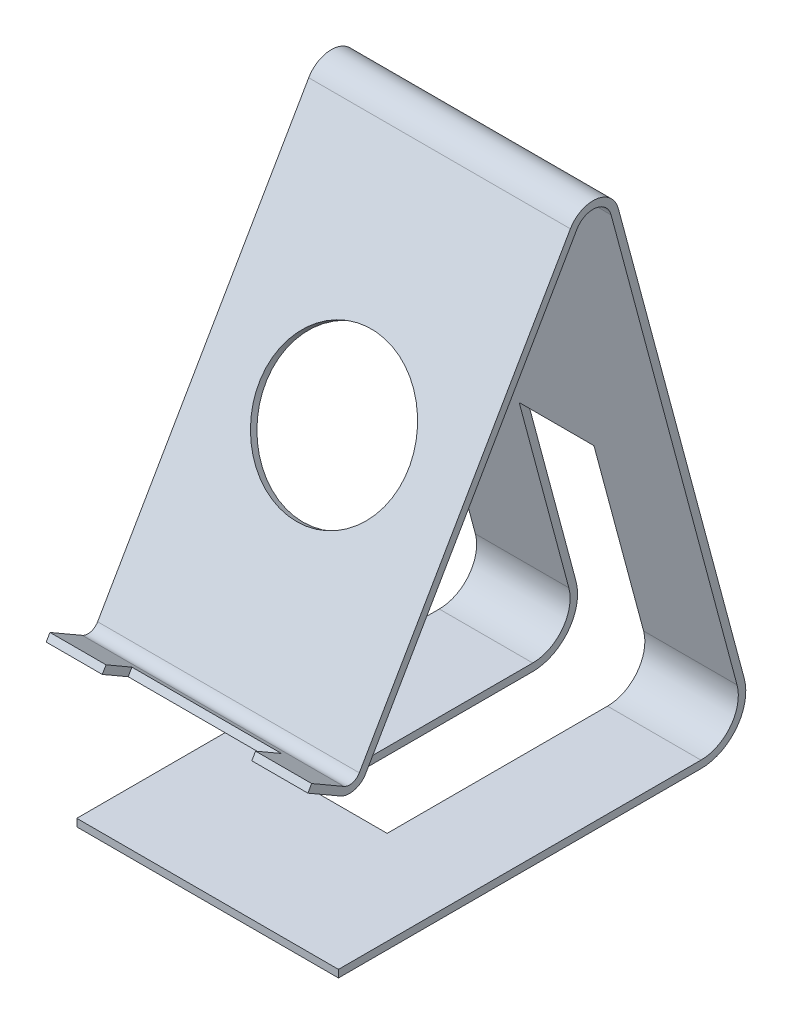
ISO-10303-21;
HEADER;
FILE_DESCRIPTION(('STEP AP214'),'2;1');
FILE_NAME('part.step','',(''),(''),'','','');
FILE_SCHEMA(('AUTOMOTIVE_DESIGN { 1 0 10303 214 1 1 1 1 }'));
ENDSEC;
DATA;
#1=APPLICATION_CONTEXT('core data for automotive mechanical design processes');
#2=APPLICATION_PROTOCOL_DEFINITION('international standard','automotive_design',2000,#1);
#3=PRODUCT_CONTEXT('',#1,'mechanical');
#4=PRODUCT('Part','Part','',(#3));
#5=PRODUCT_RELATED_PRODUCT_CATEGORY('part','',(#4));
#6=PRODUCT_DEFINITION_FORMATION('','',#4);
#7=PRODUCT_DEFINITION_CONTEXT('part definition',#1,'design');
#8=PRODUCT_DEFINITION('design','',#6,#7);
#9=PRODUCT_DEFINITION_SHAPE('','',#8);
#10=(LENGTH_UNIT() NAMED_UNIT(*) SI_UNIT(.MILLI.,.METRE.));
#11=(NAMED_UNIT(*) PLANE_ANGLE_UNIT() SI_UNIT($,.RADIAN.));
#12=(NAMED_UNIT(*) SI_UNIT($,.STERADIAN.) SOLID_ANGLE_UNIT());
#13=UNCERTAINTY_MEASURE_WITH_UNIT(LENGTH_MEASURE(1.E-05),#10,'distance_accuracy_value','');
#14=(GEOMETRIC_REPRESENTATION_CONTEXT(3) GLOBAL_UNCERTAINTY_ASSIGNED_CONTEXT((#13)) GLOBAL_UNIT_ASSIGNED_CONTEXT((#10,
#11,#12)) REPRESENTATION_CONTEXT('',''));
#15=CARTESIAN_POINT('',(0.,0.,0.));
#16=DIRECTION('',(0.,0.,1.));
#17=DIRECTION('',(1.,0.,0.));
#18=AXIS2_PLACEMENT_3D('',#15,#16,#17);
#19=CARTESIAN_POINT('',(70.,10.,-58.9456172710884));
#20=DIRECTION('',(-1.,0.,0.));
#21=DIRECTION('',(0.,0.,1.));
#22=AXIS2_PLACEMENT_3D('',#19,#20,#21);
#23=CYLINDRICAL_SURFACE('',#22,10.);
#24=CARTESIAN_POINT('',(25.,10.,-58.9456172710884));
#25=DIRECTION('',(-1.,0.,0.));
#26=DIRECTION('',(0.,0.,1.));
#27=AXIS2_PLACEMENT_3D('',#24,#25,#26);
#28=CIRCLE('',#27,10.);
#29=CARTESIAN_POINT('',(25.,12.5881904510253,-68.6048755339791));
#30=VERTEX_POINT('',#29);
#31=CARTESIAN_POINT('',(25.,0.,-58.9456172710883));
#32=VERTEX_POINT('',#31);
#33=EDGE_CURVE('E250',#30,#32,#28,.T.);
#34=ORIENTED_EDGE('',*,*,#33,.F.);
#35=DIRECTION('',(-1.,0.,0.));
#36=VECTOR('',#35,1.);
#37=CARTESIAN_POINT('',(70.,12.5881904510253,-68.6048755339791));
#38=LINE('',#37,#36);
#39=CARTESIAN_POINT('',(0.,12.5881904510253,-68.6048755339791));
#40=VERTEX_POINT('',#39);
#41=EDGE_CURVE('E387',#30,#40,#38,.T.);
#42=ORIENTED_EDGE('',*,*,#41,.T.);
#43=CARTESIAN_POINT('',(0.,10.,-58.9456172710884));
#44=DIRECTION('',(1.,0.,0.));
#45=DIRECTION('',(0.,0.,-1.));
#46=AXIS2_PLACEMENT_3D('',#43,#44,#45);
#47=CIRCLE('',#46,10.);
#48=CARTESIAN_POINT('',(0.,0.,-58.9456172710883));
#49=VERTEX_POINT('',#48);
#50=EDGE_CURVE('E341',#49,#40,#47,.T.);
#51=ORIENTED_EDGE('',*,*,#50,.F.);
#52=DIRECTION('',(-1.,0.,0.));
#53=VECTOR('',#52,1.);
#54=CARTESIAN_POINT('',(70.,0.,-58.9456172710883));
#55=LINE('',#54,#53);
#56=EDGE_CURVE('E383',#32,#49,#55,.T.);
#57=ORIENTED_EDGE('',*,*,#56,.F.);
#58=EDGE_LOOP('',(#34,#42,#51,#57));
#59=FACE_BOUND('',#58,.T.);
#60=ADVANCED_FACE('F39',(#59),#23,.F.);
#61=CARTESIAN_POINT('',(70.,10.,-58.9456172710884));
#62=DIRECTION('',(-1.,0.,0.));
#63=DIRECTION('',(0.,0.,1.));
#64=AXIS2_PLACEMENT_3D('',#61,#62,#63);
#65=CYLINDRICAL_SURFACE('',#64,12.);
#66=DIRECTION('',(-1.,0.,0.));
#67=VECTOR('',#66,1.);
#68=CARTESIAN_POINT('',(70.,13.1058285412304,-70.5367271865572));
#69=LINE('',#68,#67);
#70=CARTESIAN_POINT('',(25.,13.1058285412304,-70.5367271865572));
#71=VERTEX_POINT('',#70);
#72=CARTESIAN_POINT('',(0.,13.1058285412304,-70.5367271865572));
#73=VERTEX_POINT('',#72);
#74=EDGE_CURVE('E373',#71,#73,#69,.T.);
#75=ORIENTED_EDGE('',*,*,#74,.F.);
#76=CARTESIAN_POINT('',(25.,10.,-58.9456172710884));
#77=DIRECTION('',(-1.,0.,0.));
#78=DIRECTION('',(0.,0.,1.));
#79=AXIS2_PLACEMENT_3D('',#76,#77,#78);
#80=CIRCLE('',#79,12.);
#81=CARTESIAN_POINT('',(25.,-2.,-58.9456172710883));
#82=VERTEX_POINT('',#81);
#83=EDGE_CURVE('E248',#71,#82,#80,.T.);
#84=ORIENTED_EDGE('',*,*,#83,.T.);
#85=DIRECTION('',(-1.,0.,0.));
#86=VECTOR('',#85,1.);
#87=CARTESIAN_POINT('',(70.,-2.,-58.9456172710883));
#88=LINE('',#87,#86);
#89=CARTESIAN_POINT('',(0.,-2.,-58.9456172710883));
#90=VERTEX_POINT('',#89);
#91=EDGE_CURVE('E244',#82,#90,#88,.T.);
#92=ORIENTED_EDGE('',*,*,#91,.T.);
#93=CARTESIAN_POINT('',(0.,10.,-58.9456172710884));
#94=DIRECTION('',(1.,0.,0.));
#95=DIRECTION('',(0.,0.,-1.));
#96=AXIS2_PLACEMENT_3D('',#93,#94,#95);
#97=CIRCLE('',#96,12.);
#98=EDGE_CURVE('E352',#90,#73,#97,.T.);
#99=ORIENTED_EDGE('',*,*,#98,.T.);
#100=EDGE_LOOP('',(#75,#84,#92,#99));
#101=FACE_BOUND('',#100,.T.);
#102=ADVANCED_FACE('F426',(#101),#65,.T.);
#103=CARTESIAN_POINT('',(70.,44.9166975080222,46.2048889219341));
#104=DIRECTION('',(0.,0.499999999999991,0.866025403784444));
#105=DIRECTION('',(0.,-0.866025403784444,0.499999999999991));
#106=AXIS2_PLACEMENT_3D('',#103,#104,#105);
#107=PLANE('',#106);
#108=DIRECTION('',(0.,0.866025403784444,-0.499999999999991));
#109=VECTOR('',#108,1.);
#110=CARTESIAN_POINT('',(15.,37.9884942777467,50.2048889219341));
#111=LINE('',#110,#109);
#112=CARTESIAN_POINT('',(15.,44.9166975080222,46.2048889219341));
#113=VERTEX_POINT('',#112);
#114=CARTESIAN_POINT('',(15.,46.6487483155911,45.2048889219342));
#115=VERTEX_POINT('',#114);
#116=EDGE_CURVE('E268',#113,#115,#111,.T.);
#117=ORIENTED_EDGE('',*,*,#116,.T.);
#118=DIRECTION('',(-1.,0.,0.));
#119=VECTOR('',#118,1.);
#120=CARTESIAN_POINT('',(70.,46.6487483155911,45.2048889219342));
#121=LINE('',#120,#119);
#122=CARTESIAN_POINT('',(0.,46.6487483155911,45.2048889219342));
#123=VERTEX_POINT('',#122);
#124=EDGE_CURVE('E403',#115,#123,#121,.T.);
#125=ORIENTED_EDGE('',*,*,#124,.T.);
#126=DIRECTION('',(0.,0.866025403784444,-0.499999999999991));
#127=VECTOR('',#126,1.);
#128=CARTESIAN_POINT('',(0.,44.9166975080222,46.2048889219341));
#129=LINE('',#128,#127);
#130=CARTESIAN_POINT('',(0.,44.9166975080222,46.2048889219341));
#131=VERTEX_POINT('',#130);
#132=EDGE_CURVE('E323',#131,#123,#129,.T.);
#133=ORIENTED_EDGE('',*,*,#132,.F.);
#134=DIRECTION('',(-1.,0.,0.));
#135=VECTOR('',#134,1.);
#136=CARTESIAN_POINT('',(70.,44.9166975080222,46.2048889219341));
#137=LINE('',#136,#135);
#138=EDGE_CURVE('E399',#113,#131,#137,.T.);
#139=ORIENTED_EDGE('',*,*,#138,.F.);
#140=EDGE_LOOP('',(#117,#125,#133,#139));
#141=FACE_BOUND('',#140,.T.);
#142=ADVANCED_FACE('F510',(#141),#107,.T.);
#143=CARTESIAN_POINT('',(70.,41.6487483155912,36.5446348840897));
#144=DIRECTION('',(0.,-0.866025403784444,0.499999999999991));
#145=DIRECTION('',(0.,-0.499999999999991,-0.866025403784444));
#146=AXIS2_PLACEMENT_3D('',#143,#144,#145);
#147=PLANE('',#146);
#148=ORIENTED_EDGE('',*,*,#124,.F.);
#149=DIRECTION('',(0.,0.499999999999992,0.866025403784443));
#150=VECTOR('',#149,1.);
#151=CARTESIAN_POINT('',(15.,46.6487483155911,45.2048889219342));
#152=LINE('',#151,#150);
#153=CARTESIAN_POINT('',(15.,42.6487483155912,38.2766856916586));
#154=VERTEX_POINT('',#153);
#155=EDGE_CURVE('E260',#154,#115,#152,.T.);
#156=ORIENTED_EDGE('',*,*,#155,.F.);
#157=DIRECTION('',(-1.,0.,0.));
#158=VECTOR('',#157,1.);
#159=CARTESIAN_POINT('',(15.,42.6487483155912,38.2766856916586));
#160=LINE('',#159,#158);
#161=CARTESIAN_POINT('',(55.,42.6487483155912,38.2766856916586));
#162=VERTEX_POINT('',#161);
#163=EDGE_CURVE('E265',#162,#154,#160,.T.);
#164=ORIENTED_EDGE('',*,*,#163,.F.);
#165=DIRECTION('',(0.,-0.499999999999992,-0.866025403784443));
#166=VECTOR('',#165,1.);
#167=CARTESIAN_POINT('',(55.,46.6487483155911,45.2048889219342));
#168=LINE('',#167,#166);
#169=CARTESIAN_POINT('',(55.,46.6487483155911,45.2048889219342));
#170=VERTEX_POINT('',#169);
#171=EDGE_CURVE('E262',#170,#162,#168,.T.);
#172=ORIENTED_EDGE('',*,*,#171,.F.);
#173=CARTESIAN_POINT('',(70.,46.6487483155911,45.2048889219342));
#174=VERTEX_POINT('',#173);
#175=EDGE_CURVE('E404',#174,#170,#121,.T.);
#176=ORIENTED_EDGE('',*,*,#175,.F.);
#177=DIRECTION('',(0.,0.499999999999991,0.866025403784444));
#178=VECTOR('',#177,1.);
#179=CARTESIAN_POINT('',(70.,41.6487483155912,36.5446348840897));
#180=LINE('',#179,#178);
#181=CARTESIAN_POINT('',(70.,41.6487483155912,36.5446348840897));
#182=VERTEX_POINT('',#181);
#183=EDGE_CURVE('E278',#182,#174,#180,.T.);
#184=ORIENTED_EDGE('',*,*,#183,.F.);
#185=DIRECTION('',(-1.,0.,0.));
#186=VECTOR('',#185,1.);
#187=CARTESIAN_POINT('',(70.,41.6487483155912,36.5446348840897));
#188=LINE('',#187,#186);
#189=CARTESIAN_POINT('',(0.,41.6487483155912,36.5446348840897));
#190=VERTEX_POINT('',#189);
#191=EDGE_CURVE('E320',#182,#190,#188,.T.);
#192=ORIENTED_EDGE('',*,*,#191,.T.);
#193=DIRECTION('',(0.,0.499999999999991,0.866025403784444));
#194=VECTOR('',#193,1.);
#195=CARTESIAN_POINT('',(0.,41.6487483155912,36.5446348840897));
#196=LINE('',#195,#194);
#197=EDGE_CURVE('E271',#190,#123,#196,.T.);
#198=ORIENTED_EDGE('',*,*,#197,.T.);
#199=EDGE_LOOP('',(#148,#156,#164,#172,#176,#184,#192,#198));
#200=FACE_BOUND('',#199,.T.);
#201=ADVANCED_FACE('F41',(#200),#147,.F.);
#202=DIRECTION('',(0.,0.866025403784444,-0.499999999999991));
#203=VECTOR('',#202,1.);
#204=CARTESIAN_POINT('',(55.,37.9884942777467,50.2048889219341));
#205=LINE('',#204,#203);
#206=CARTESIAN_POINT('',(55.,44.9166975080222,46.2048889219341));
#207=VERTEX_POINT('',#206);
#208=EDGE_CURVE('E274',#207,#170,#205,.T.);
#209=ORIENTED_EDGE('',*,*,#208,.F.);
#210=CARTESIAN_POINT('',(70.,44.9166975080222,46.2048889219341));
#211=VERTEX_POINT('',#210);
#212=EDGE_CURVE('E400',#211,#207,#137,.T.);
#213=ORIENTED_EDGE('',*,*,#212,.F.);
#214=DIRECTION('',(0.,0.866025403784444,-0.499999999999991));
#215=VECTOR('',#214,1.);
#216=CARTESIAN_POINT('',(70.,44.9166975080222,46.2048889219341));
#217=LINE('',#216,#215);
#218=EDGE_CURVE('E280',#211,#174,#217,.T.);
#219=ORIENTED_EDGE('',*,*,#218,.T.);
#220=ORIENTED_EDGE('',*,*,#175,.T.);
#221=EDGE_LOOP('',(#209,#213,#219,#220));
#222=FACE_BOUND('',#221,.T.);
#223=ADVANCED_FACE('F531',(#222),#107,.T.);
#224=CARTESIAN_POINT('',(70.,39.9166975080223,37.5446348840897));
#225=DIRECTION('',(0.,-0.866025403784444,0.499999999999991));
#226=DIRECTION('',(0.,-0.499999999999991,-0.866025403784444));
#227=AXIS2_PLACEMENT_3D('',#224,#225,#226);
#228=PLANE('',#227);
#229=DIRECTION('',(0.,-0.499999999999991,-0.866025403784444));
#230=VECTOR('',#229,1.);
#231=CARTESIAN_POINT('',(15.,39.9166975080223,37.5446348840897));
#232=LINE('',#231,#230);
#233=CARTESIAN_POINT('',(15.,40.9166975080223,39.2766856916586));
#234=VERTEX_POINT('',#233);
#235=EDGE_CURVE('E412',#113,#234,#232,.T.);
#236=ORIENTED_EDGE('',*,*,#235,.F.);
#237=ORIENTED_EDGE('',*,*,#138,.T.);
#238=DIRECTION('',(0.,0.499999999999991,0.866025403784444));
#239=VECTOR('',#238,1.);
#240=CARTESIAN_POINT('',(0.,39.9166975080223,37.5446348840897));
#241=LINE('',#240,#239);
#242=CARTESIAN_POINT('',(0.,39.9166975080223,37.5446348840897));
#243=VERTEX_POINT('',#242);
#244=EDGE_CURVE('E326',#243,#131,#241,.T.);
#245=ORIENTED_EDGE('',*,*,#244,.F.);
#246=DIRECTION('',(-1.,0.,0.));
#247=VECTOR('',#246,1.);
#248=CARTESIAN_POINT('',(70.,39.9166975080223,37.5446348840897));
#249=LINE('',#248,#247);
#250=CARTESIAN_POINT('',(70.,39.9166975080223,37.5446348840897));
#251=VERTEX_POINT('',#250);
#252=EDGE_CURVE('E397',#251,#243,#249,.T.);
#253=ORIENTED_EDGE('',*,*,#252,.F.);
#254=DIRECTION('',(0.,0.499999999999991,0.866025403784444));
#255=VECTOR('',#254,1.);
#256=CARTESIAN_POINT('',(70.,39.9166975080223,37.5446348840897));
#257=LINE('',#256,#255);
#258=EDGE_CURVE('E284',#251,#211,#257,.T.);
#259=ORIENTED_EDGE('',*,*,#258,.T.);
#260=ORIENTED_EDGE('',*,*,#212,.T.);
#261=DIRECTION('',(0.,0.499999999999991,0.866025403784444));
#262=VECTOR('',#261,1.);
#263=CARTESIAN_POINT('',(55.,39.9166975080223,37.5446348840897));
#264=LINE('',#263,#262);
#265=CARTESIAN_POINT('',(55.,40.9166975080223,39.2766856916586));
#266=VERTEX_POINT('',#265);
#267=EDGE_CURVE('E407',#266,#207,#264,.T.);
#268=ORIENTED_EDGE('',*,*,#267,.F.);
#269=DIRECTION('',(1.,0.,0.));
#270=VECTOR('',#269,1.);
#271=CARTESIAN_POINT('',(70.,40.9166975080223,39.2766856916586));
#272=LINE('',#271,#270);
#273=EDGE_CURVE('E409',#234,#266,#272,.T.);
#274=ORIENTED_EDGE('',*,*,#273,.F.);
#275=EDGE_LOOP('',(#236,#237,#245,#253,#259,#260,#268,#274));
#276=FACE_BOUND('',#275,.T.);
#277=ADVANCED_FACE('F528',(#276),#228,.T.);
#278=CARTESIAN_POINT('',(70.,44.2468245269445,35.0446348840897));
#279=DIRECTION('',(-1.,0.,0.));
#280=DIRECTION('',(0.,0.,1.));
#281=AXIS2_PLACEMENT_3D('',#278,#279,#280);
#282=CYLINDRICAL_SURFACE('',#281,4.99999999999999);
#283=CARTESIAN_POINT('',(0.,44.2468245269445,35.0446348840897));
#284=DIRECTION('',(-1.,0.,0.));
#285=DIRECTION('',(0.,0.,1.));
#286=AXIS2_PLACEMENT_3D('',#283,#284,#285);
#287=CIRCLE('',#286,4.99999999999999);
#288=CARTESIAN_POINT('',(0.,41.7468245269446,30.7145078651675));
#289=VERTEX_POINT('',#288);
#290=EDGE_CURVE('E329',#289,#243,#287,.T.);
#291=ORIENTED_EDGE('',*,*,#290,.F.);
#292=DIRECTION('',(-1.,0.,0.));
#293=VECTOR('',#292,1.);
#294=CARTESIAN_POINT('',(70.,41.7468245269446,30.7145078651675));
#295=LINE('',#294,#293);
#296=CARTESIAN_POINT('',(70.,41.7468245269446,30.7145078651675));
#297=VERTEX_POINT('',#296);
#298=EDGE_CURVE('E395',#297,#289,#295,.T.);
#299=ORIENTED_EDGE('',*,*,#298,.F.);
#300=CARTESIAN_POINT('',(70.,44.2468245269445,35.0446348840897));
#301=DIRECTION('',(-1.,0.,0.));
#302=DIRECTION('',(0.,0.,1.));
#303=AXIS2_PLACEMENT_3D('',#300,#301,#302);
#304=CIRCLE('',#303,4.99999999999999);
#305=EDGE_CURVE('E287',#297,#251,#304,.T.);
#306=ORIENTED_EDGE('',*,*,#305,.T.);
#307=ORIENTED_EDGE('',*,*,#252,.T.);
#308=EDGE_LOOP('',(#291,#299,#306,#307));
#309=FACE_BOUND('',#308,.T.);
#310=ADVANCED_FACE('F524',(#309),#282,.T.);
#311=CARTESIAN_POINT('',(70.,139.54614862412,-25.7499582288987));
#312=DIRECTION('',(0.,-0.499999999999992,-0.866025403784444));
#313=DIRECTION('',(0.,0.866025403784444,-0.499999999999992));
#314=AXIS2_PLACEMENT_3D('',#311,#312,#313);
#315=PLANE('',#314);
#316=CARTESIAN_POINT('',(35.,90.6464865755321,2.48227481813441));
#317=DIRECTION('',(0.,0.499999999999992,0.866025403784443));
#318=DIRECTION('',(0.,-0.866025403784444,0.499999999999992));
#319=AXIS2_PLACEMENT_3D('',#316,#317,#318);
#320=CIRCLE('',#319,20.);
#321=CARTESIAN_POINT('',(35.,73.3259784998432,12.4822748181342));
#322=VERTEX_POINT('',#321);
#323=EDGE_CURVE('E766',#322,#322,#320,.T.);
#324=ORIENTED_EDGE('',*,*,#323,.T.);
#325=EDGE_LOOP('',(#324));
#326=FACE_BOUND('',#325,.T.);
#327=DIRECTION('',(0.,-0.866025403784444,0.499999999999991));
#328=VECTOR('',#327,1.);
#329=CARTESIAN_POINT('',(0.,139.54614862412,-25.7499582288987));
#330=LINE('',#329,#328);
#331=CARTESIAN_POINT('',(0.,139.54614862412,-25.7499582288987));
#332=VERTEX_POINT('',#331);
#333=EDGE_CURVE('E332',#332,#289,#330,.T.);
#334=ORIENTED_EDGE('',*,*,#333,.F.);
#335=DIRECTION('',(-1.,0.,0.));
#336=VECTOR('',#335,1.);
#337=CARTESIAN_POINT('',(70.,139.54614862412,-25.7499582288987));
#338=LINE('',#337,#336);
#339=CARTESIAN_POINT('',(70.,139.54614862412,-25.7499582288987));
#340=VERTEX_POINT('',#339);
#341=EDGE_CURVE('E393',#340,#332,#338,.T.);
#342=ORIENTED_EDGE('',*,*,#341,.F.);
#343=DIRECTION('',(0.,-0.866025403784444,0.499999999999991));
#344=VECTOR('',#343,1.);
#345=CARTESIAN_POINT('',(70.,139.54614862412,-25.7499582288987));
#346=LINE('',#345,#344);
#347=EDGE_CURVE('E290',#340,#297,#346,.T.);
#348=ORIENTED_EDGE('',*,*,#347,.T.);
#349=ORIENTED_EDGE('',*,*,#298,.T.);
#350=EDGE_LOOP('',(#334,#342,#348,#349));
#351=FACE_BOUND('',#350,.T.);
#352=ADVANCED_FACE('F519',(#326,#351),#315,.T.);
#353=CARTESIAN_POINT('',(70.,137.04614862412,-30.080085247821));
#354=DIRECTION('',(-1.,0.,0.));
#355=DIRECTION('',(0.,0.,1.));
#356=AXIS2_PLACEMENT_3D('',#353,#354,#355);
#357=CYLINDRICAL_SURFACE('',#356,5.00000000000001);
#358=CARTESIAN_POINT('',(0.,137.04614862412,-30.080085247821));
#359=DIRECTION('',(1.,0.,0.));
#360=DIRECTION('',(0.,0.,-1.));
#361=AXIS2_PLACEMENT_3D('',#358,#359,#360);
#362=CIRCLE('',#361,5.00000000000001);
#363=CARTESIAN_POINT('',(0.,138.340243849632,-34.9097143792663));
#364=VERTEX_POINT('',#363);
#365=EDGE_CURVE('E335',#364,#332,#362,.T.);
#366=ORIENTED_EDGE('',*,*,#365,.F.);
#367=DIRECTION('',(-1.,0.,0.));
#368=VECTOR('',#367,1.);
#369=CARTESIAN_POINT('',(70.,138.340243849632,-34.9097143792663));
#370=LINE('',#369,#368);
#371=CARTESIAN_POINT('',(70.,138.340243849632,-34.9097143792663));
#372=VERTEX_POINT('',#371);
#373=EDGE_CURVE('E391',#372,#364,#370,.T.);
#374=ORIENTED_EDGE('',*,*,#373,.F.);
#375=CARTESIAN_POINT('',(70.,137.04614862412,-30.080085247821));
#376=DIRECTION('',(1.,0.,0.));
#377=DIRECTION('',(0.,0.,-1.));
#378=AXIS2_PLACEMENT_3D('',#375,#376,#377);
#379=CIRCLE('',#378,5.00000000000001);
#380=EDGE_CURVE('E293',#372,#340,#379,.T.);
#381=ORIENTED_EDGE('',*,*,#380,.T.);
#382=ORIENTED_EDGE('',*,*,#341,.T.);
#383=EDGE_LOOP('',(#366,#374,#381,#382));
#384=FACE_BOUND('',#383,.T.);
#385=ADVANCED_FACE('F487',(#384),#357,.F.);
#386=CARTESIAN_POINT('',(70.,12.5881904510253,-68.6048755339791));
#387=DIRECTION('',(0.,-0.258819045102525,0.965925826289067));
#388=DIRECTION('',(0.,-0.965925826289067,-0.258819045102525));
#389=AXIS2_PLACEMENT_3D('',#386,#387,#388);
#390=PLANE('',#389);
#391=DIRECTION('',(0.,-0.965925826289067,-0.258819045102525));
#392=VECTOR('',#391,1.);
#393=CARTESIAN_POINT('',(25.,12.5881904510253,-68.6048755339791));
#394=LINE('',#393,#392);
#395=CARTESIAN_POINT('',(25.,62.1528353546238,-55.3240689589243));
#396=VERTEX_POINT('',#395);
#397=EDGE_CURVE('E257',#396,#30,#394,.T.);
#398=ORIENTED_EDGE('',*,*,#397,.F.);
#399=DIRECTION('',(-1.,0.,0.));
#400=VECTOR('',#399,1.);
#401=CARTESIAN_POINT('',(70.,62.1528353546238,-55.3240689589243));
#402=LINE('',#401,#400);
#403=CARTESIAN_POINT('',(45.,62.1528353546238,-55.3240689589243));
#404=VERTEX_POINT('',#403);
#405=EDGE_CURVE('E252',#404,#396,#402,.T.);
#406=ORIENTED_EDGE('',*,*,#405,.F.);
#407=DIRECTION('',(0.,0.965925826289067,0.258819045102525));
#408=VECTOR('',#407,1.);
#409=CARTESIAN_POINT('',(45.,12.5881904510253,-68.6048755339791));
#410=LINE('',#409,#408);
#411=CARTESIAN_POINT('',(45.,12.5881904510253,-68.6048755339791));
#412=VERTEX_POINT('',#411);
#413=EDGE_CURVE('E457',#412,#404,#410,.T.);
#414=ORIENTED_EDGE('',*,*,#413,.F.);
#415=CARTESIAN_POINT('',(70.,12.5881904510253,-68.6048755339791));
#416=VERTEX_POINT('',#415);
#417=EDGE_CURVE('E388',#416,#412,#38,.T.);
#418=ORIENTED_EDGE('',*,*,#417,.F.);
#419=DIRECTION('',(0.,0.965925826289067,0.258819045102525));
#420=VECTOR('',#419,1.);
#421=CARTESIAN_POINT('',(70.,12.5881904510253,-68.6048755339791));
#422=LINE('',#421,#420);
#423=EDGE_CURVE('E296',#416,#372,#422,.T.);
#424=ORIENTED_EDGE('',*,*,#423,.T.);
#425=ORIENTED_EDGE('',*,*,#373,.T.);
#426=DIRECTION('',(0.,0.965925826289067,0.258819045102525));
#427=VECTOR('',#426,1.);
#428=CARTESIAN_POINT('',(0.,12.5881904510253,-68.6048755339791));
#429=LINE('',#428,#427);
#430=EDGE_CURVE('E338',#40,#364,#429,.T.);
#431=ORIENTED_EDGE('',*,*,#430,.F.);
#432=ORIENTED_EDGE('',*,*,#41,.F.);
#433=EDGE_LOOP('',(#398,#406,#414,#418,#424,#425,#431,#432));
#434=FACE_BOUND('',#433,.T.);
#435=ADVANCED_FACE('F467',(#434),#390,.T.);
#436=CARTESIAN_POINT('',(45.,10.,-58.9456172710884));
#437=DIRECTION('',(1.,0.,0.));
#438=DIRECTION('',(0.,0.,-1.));
#439=AXIS2_PLACEMENT_3D('',#436,#437,#438);
#440=CIRCLE('',#439,10.);
#441=CARTESIAN_POINT('',(45.,0.,-58.9456172710883));
#442=VERTEX_POINT('',#441);
#443=EDGE_CURVE('E455',#442,#412,#440,.T.);
#444=ORIENTED_EDGE('',*,*,#443,.F.);
#445=CARTESIAN_POINT('',(70.,0.,-58.9456172710883));
#446=VERTEX_POINT('',#445);
#447=EDGE_CURVE('E384',#446,#442,#55,.T.);
#448=ORIENTED_EDGE('',*,*,#447,.F.);
#449=CARTESIAN_POINT('',(70.,10.,-58.9456172710884));
#450=DIRECTION('',(1.,0.,0.));
#451=DIRECTION('',(0.,0.,-1.));
#452=AXIS2_PLACEMENT_3D('',#449,#450,#451);
#453=CIRCLE('',#452,10.);
#454=EDGE_CURVE('E299',#446,#416,#453,.T.);
#455=ORIENTED_EDGE('',*,*,#454,.T.);
#456=ORIENTED_EDGE('',*,*,#417,.T.);
#457=EDGE_LOOP('',(#444,#448,#455,#456));
#458=FACE_BOUND('',#457,.T.);
#459=ADVANCED_FACE('F478',(#458),#23,.F.);
#460=CARTESIAN_POINT('',(70.,0.,38.0221290004995));
#461=DIRECTION('',(0.,1.,0.));
#462=DIRECTION('',(0.,0.,1.));
#463=AXIS2_PLACEMENT_3D('',#460,#461,#462);
#464=PLANE('',#463);
#465=DIRECTION('',(0.,0.,1.));
#466=VECTOR('',#465,1.);
#467=CARTESIAN_POINT('',(25.,0.,38.0221290004995));
#468=LINE('',#467,#466);
#469=CARTESIAN_POINT('',(25.,0.,0.));
#470=VERTEX_POINT('',#469);
#471=EDGE_CURVE('E247',#32,#470,#468,.T.);
#472=ORIENTED_EDGE('',*,*,#471,.F.);
#473=ORIENTED_EDGE('',*,*,#56,.T.);
#474=DIRECTION('',(0.,0.,-1.));
#475=VECTOR('',#474,1.);
#476=CARTESIAN_POINT('',(0.,0.,38.0221290004995));
#477=LINE('',#476,#475);
#478=CARTESIAN_POINT('',(0.,0.,38.0221290004995));
#479=VERTEX_POINT('',#478);
#480=EDGE_CURVE('E344',#479,#49,#477,.T.);
#481=ORIENTED_EDGE('',*,*,#480,.F.);
#482=DIRECTION('',(-1.,0.,0.));
#483=VECTOR('',#482,1.);
#484=CARTESIAN_POINT('',(70.,0.,38.0221290004995));
#485=LINE('',#484,#483);
#486=CARTESIAN_POINT('',(70.,0.,38.0221290004995));
#487=VERTEX_POINT('',#486);
#488=EDGE_CURVE('E381',#487,#479,#485,.T.);
#489=ORIENTED_EDGE('',*,*,#488,.F.);
#490=DIRECTION('',(0.,0.,-1.));
#491=VECTOR('',#490,1.);
#492=CARTESIAN_POINT('',(70.,0.,38.0221290004995));
#493=LINE('',#492,#491);
#494=EDGE_CURVE('E302',#487,#446,#493,.T.);
#495=ORIENTED_EDGE('',*,*,#494,.T.);
#496=ORIENTED_EDGE('',*,*,#447,.T.);
#497=DIRECTION('',(0.,0.,-1.));
#498=VECTOR('',#497,1.);
#499=CARTESIAN_POINT('',(45.,0.,38.0221290004995));
#500=LINE('',#499,#498);
#501=CARTESIAN_POINT('',(45.,0.,0.));
#502=VERTEX_POINT('',#501);
#503=EDGE_CURVE('E233',#502,#442,#500,.T.);
#504=ORIENTED_EDGE('',*,*,#503,.F.);
#505=DIRECTION('',(-1.,0.,0.));
#506=VECTOR('',#505,1.);
#507=CARTESIAN_POINT('',(70.,0.,0.));
#508=LINE('',#507,#506);
#509=EDGE_CURVE('E237',#502,#470,#508,.T.);
#510=ORIENTED_EDGE('',*,*,#509,.T.);
#511=EDGE_LOOP('',(#472,#473,#481,#489,#495,#496,#504,#510));
#512=FACE_BOUND('',#511,.T.);
#513=ADVANCED_FACE('F474',(#512),#464,.T.);
#514=CARTESIAN_POINT('',(70.,-2.,38.0221290004995));
#515=DIRECTION('',(0.,0.,1.));
#516=DIRECTION('',(1.,0.,0.));
#517=AXIS2_PLACEMENT_3D('',#514,#515,#516);
#518=PLANE('',#517);
#519=DIRECTION('',(0.,1.,0.));
#520=VECTOR('',#519,1.);
#521=CARTESIAN_POINT('',(0.,-2.,38.0221290004995));
#522=LINE('',#521,#520);
#523=CARTESIAN_POINT('',(0.,-2.,38.0221290004995));
#524=VERTEX_POINT('',#523);
#525=EDGE_CURVE('E347',#524,#479,#522,.T.);
#526=ORIENTED_EDGE('',*,*,#525,.F.);
#527=DIRECTION('',(-1.,0.,0.));
#528=VECTOR('',#527,1.);
#529=CARTESIAN_POINT('',(70.,-2.,38.0221290004995));
#530=LINE('',#529,#528);
#531=CARTESIAN_POINT('',(70.,-2.,38.0221290004995));
#532=VERTEX_POINT('',#531);
#533=EDGE_CURVE('E379',#532,#524,#530,.T.);
#534=ORIENTED_EDGE('',*,*,#533,.F.);
#535=DIRECTION('',(0.,1.,0.));
#536=VECTOR('',#535,1.);
#537=CARTESIAN_POINT('',(70.,-2.,38.0221290004995));
#538=LINE('',#537,#536);
#539=EDGE_CURVE('E305',#532,#487,#538,.T.);
#540=ORIENTED_EDGE('',*,*,#539,.T.);
#541=ORIENTED_EDGE('',*,*,#488,.T.);
#542=EDGE_LOOP('',(#526,#534,#540,#541));
#543=FACE_BOUND('',#542,.T.);
#544=ADVANCED_FACE('F492',(#543),#518,.T.);
#545=CARTESIAN_POINT('',(70.,-2.,38.0221290004995));
#546=DIRECTION('',(0.,1.,0.));
#547=DIRECTION('',(0.,0.,1.));
#548=AXIS2_PLACEMENT_3D('',#545,#546,#547);
#549=PLANE('',#548);
#550=ORIENTED_EDGE('',*,*,#91,.F.);
#551=DIRECTION('',(0.,0.,1.));
#552=VECTOR('',#551,1.);
#553=CARTESIAN_POINT('',(25.,-2.,38.0221290004995));
#554=LINE('',#553,#552);
#555=CARTESIAN_POINT('',(25.,-2.,0.));
#556=VERTEX_POINT('',#555);
#557=EDGE_CURVE('E242',#82,#556,#554,.T.);
#558=ORIENTED_EDGE('',*,*,#557,.T.);
#559=DIRECTION('',(-1.,0.,0.));
#560=VECTOR('',#559,1.);
#561=CARTESIAN_POINT('',(70.,-2.,0.));
#562=LINE('',#561,#560);
#563=CARTESIAN_POINT('',(45.,-2.,0.));
#564=VERTEX_POINT('',#563);
#565=EDGE_CURVE('E11',#564,#556,#562,.T.);
#566=ORIENTED_EDGE('',*,*,#565,.F.);
#567=DIRECTION('',(0.,0.,-1.));
#568=VECTOR('',#567,1.);
#569=CARTESIAN_POINT('',(45.,-2.,38.0221290004995));
#570=LINE('',#569,#568);
#571=CARTESIAN_POINT('',(45.,-2.,-58.9456172710883));
#572=VERTEX_POINT('',#571);
#573=EDGE_CURVE('E222',#564,#572,#570,.T.);
#574=ORIENTED_EDGE('',*,*,#573,.T.);
#575=CARTESIAN_POINT('',(70.,-2.,-58.9456172710883));
#576=VERTEX_POINT('',#575);
#577=EDGE_CURVE('E377',#576,#572,#88,.T.);
#578=ORIENTED_EDGE('',*,*,#577,.F.);
#579=DIRECTION('',(0.,0.,-1.));
#580=VECTOR('',#579,1.);
#581=CARTESIAN_POINT('',(70.,-2.,38.0221290004995));
#582=LINE('',#581,#580);
#583=EDGE_CURVE('E308',#532,#576,#582,.T.);
#584=ORIENTED_EDGE('',*,*,#583,.F.);
#585=ORIENTED_EDGE('',*,*,#533,.T.);
#586=DIRECTION('',(0.,0.,-1.));
#587=VECTOR('',#586,1.);
#588=CARTESIAN_POINT('',(0.,-2.,38.0221290004995));
#589=LINE('',#588,#587);
#590=EDGE_CURVE('E350',#524,#90,#589,.T.);
#591=ORIENTED_EDGE('',*,*,#590,.T.);
#592=EDGE_LOOP('',(#550,#558,#566,#574,#578,#584,#585,#591));
#593=FACE_BOUND('',#592,.T.);
#594=ADVANCED_FACE('F241',(#593),#549,.F.);
#595=ORIENTED_EDGE('',*,*,#577,.T.);
#596=CARTESIAN_POINT('',(45.,10.,-58.9456172710884));
#597=DIRECTION('',(1.,0.,0.));
#598=DIRECTION('',(0.,0.,-1.));
#599=AXIS2_PLACEMENT_3D('',#596,#597,#598);
#600=CIRCLE('',#599,12.);
#601=CARTESIAN_POINT('',(45.,13.1058285412304,-70.5367271865572));
#602=VERTEX_POINT('',#601);
#603=EDGE_CURVE('E228',#572,#602,#600,.T.);
#604=ORIENTED_EDGE('',*,*,#603,.T.);
#605=CARTESIAN_POINT('',(70.,13.1058285412304,-70.5367271865572));
#606=VERTEX_POINT('',#605);
#607=EDGE_CURVE('E374',#606,#602,#69,.T.);
#608=ORIENTED_EDGE('',*,*,#607,.F.);
#609=CARTESIAN_POINT('',(70.,10.,-58.9456172710884));
#610=DIRECTION('',(1.,0.,0.));
#611=DIRECTION('',(0.,0.,-1.));
#612=AXIS2_PLACEMENT_3D('',#609,#610,#611);
#613=CIRCLE('',#612,12.);
#614=EDGE_CURVE('E310',#576,#606,#613,.T.);
#615=ORIENTED_EDGE('',*,*,#614,.F.);
#616=EDGE_LOOP('',(#595,#604,#608,#615));
#617=FACE_BOUND('',#616,.T.);
#618=ADVANCED_FACE('F448',(#617),#65,.T.);
#619=CARTESIAN_POINT('',(70.,13.1058285412304,-70.5367271865572));
#620=DIRECTION('',(0.,-0.258819045102525,0.965925826289067));
#621=DIRECTION('',(0.,-0.965925826289067,-0.258819045102525));
#622=AXIS2_PLACEMENT_3D('',#619,#620,#621);
#623=PLANE('',#622);
#624=DIRECTION('',(-1.,0.,0.));
#625=VECTOR('',#624,1.);
#626=CARTESIAN_POINT('',(70.,62.1528353546238,-57.3946213197444));
#627=LINE('',#626,#625);
#628=CARTESIAN_POINT('',(45.,62.1528353546238,-57.3946213197444));
#629=VERTEX_POINT('',#628);
#630=CARTESIAN_POINT('',(25.,62.1528353546238,-57.3946213197444));
#631=VERTEX_POINT('',#630);
#632=EDGE_CURVE('E417',#629,#631,#627,.T.);
#633=ORIENTED_EDGE('',*,*,#632,.T.);
#634=DIRECTION('',(0.,-0.965925826289067,-0.258819045102525));
#635=VECTOR('',#634,1.);
#636=CARTESIAN_POINT('',(25.,13.1058285412304,-70.5367271865572));
#637=LINE('',#636,#635);
#638=EDGE_CURVE('E47',#631,#71,#637,.T.);
#639=ORIENTED_EDGE('',*,*,#638,.T.);
#640=ORIENTED_EDGE('',*,*,#74,.T.);
#641=DIRECTION('',(0.,0.965925826289067,0.258819045102525));
#642=VECTOR('',#641,1.);
#643=CARTESIAN_POINT('',(0.,13.1058285412304,-70.5367271865572));
#644=LINE('',#643,#642);
#645=CARTESIAN_POINT('',(0.,138.857881939837,-36.8415660318444));
#646=VERTEX_POINT('',#645);
#647=EDGE_CURVE('E355',#73,#646,#644,.T.);
#648=ORIENTED_EDGE('',*,*,#647,.T.);
#649=DIRECTION('',(-1.,0.,0.));
#650=VECTOR('',#649,1.);
#651=CARTESIAN_POINT('',(70.,138.857881939837,-36.8415660318444));
#652=LINE('',#651,#650);
#653=CARTESIAN_POINT('',(70.,138.857881939837,-36.8415660318444));
#654=VERTEX_POINT('',#653);
#655=EDGE_CURVE('E370',#654,#646,#652,.T.);
#656=ORIENTED_EDGE('',*,*,#655,.F.);
#657=DIRECTION('',(0.,0.965925826289067,0.258819045102525));
#658=VECTOR('',#657,1.);
#659=CARTESIAN_POINT('',(70.,13.1058285412304,-70.5367271865572));
#660=LINE('',#659,#658);
#661=EDGE_CURVE('E312',#606,#654,#660,.T.);
#662=ORIENTED_EDGE('',*,*,#661,.F.);
#663=ORIENTED_EDGE('',*,*,#607,.T.);
#664=DIRECTION('',(0.,0.965925826289067,0.258819045102525));
#665=VECTOR('',#664,1.);
#666=CARTESIAN_POINT('',(45.,13.1058285412304,-70.5367271865572));
#667=LINE('',#666,#665);
#668=EDGE_CURVE('E414',#602,#629,#667,.T.);
#669=ORIENTED_EDGE('',*,*,#668,.T.);
#670=EDGE_LOOP('',(#633,#639,#640,#648,#656,#662,#663,#669));
#671=FACE_BOUND('',#670,.T.);
#672=ADVANCED_FACE('F422',(#671),#623,.F.);
#673=CARTESIAN_POINT('',(70.,137.04614862412,-30.080085247821));
#674=DIRECTION('',(-1.,0.,0.));
#675=DIRECTION('',(0.,0.,1.));
#676=AXIS2_PLACEMENT_3D('',#673,#674,#675);
#677=CYLINDRICAL_SURFACE('',#676,7.00000000000001);
#678=CARTESIAN_POINT('',(0.,137.04614862412,-30.080085247821));
#679=DIRECTION('',(1.,0.,0.));
#680=DIRECTION('',(0.,0.,-1.));
#681=AXIS2_PLACEMENT_3D('',#678,#679,#680);
#682=CIRCLE('',#681,7.00000000000001);
#683=CARTESIAN_POINT('',(0.,140.54614862412,-24.0179074213298));
#684=VERTEX_POINT('',#683);
#685=EDGE_CURVE('E357',#646,#684,#682,.T.);
#686=ORIENTED_EDGE('',*,*,#685,.T.);
#687=DIRECTION('',(-1.,0.,0.));
#688=VECTOR('',#687,1.);
#689=CARTESIAN_POINT('',(70.,140.54614862412,-24.0179074213298));
#690=LINE('',#689,#688);
#691=CARTESIAN_POINT('',(70.,140.54614862412,-24.0179074213298));
#692=VERTEX_POINT('',#691);
#693=EDGE_CURVE('E367',#692,#684,#690,.T.);
#694=ORIENTED_EDGE('',*,*,#693,.F.);
#695=CARTESIAN_POINT('',(70.,137.04614862412,-30.080085247821));
#696=DIRECTION('',(1.,0.,0.));
#697=DIRECTION('',(0.,0.,-1.));
#698=AXIS2_PLACEMENT_3D('',#695,#696,#697);
#699=CIRCLE('',#698,7.00000000000001);
#700=EDGE_CURVE('E314',#654,#692,#699,.T.);
#701=ORIENTED_EDGE('',*,*,#700,.F.);
#702=ORIENTED_EDGE('',*,*,#655,.T.);
#703=EDGE_LOOP('',(#686,#694,#701,#702));
#704=FACE_BOUND('',#703,.T.);
#705=ADVANCED_FACE('F439',(#704),#677,.T.);
#706=CARTESIAN_POINT('',(70.,140.54614862412,-24.0179074213298));
#707=DIRECTION('',(0.,-0.499999999999992,-0.866025403784444));
#708=DIRECTION('',(0.,0.866025403784444,-0.499999999999992));
#709=AXIS2_PLACEMENT_3D('',#706,#707,#708);
#710=PLANE('',#709);
#711=CARTESIAN_POINT('',(35.,91.6464865755321,4.2143256257033));
#712=DIRECTION('',(0.,0.499999999999992,0.866025403784443));
#713=DIRECTION('',(0.,-0.866025403784444,0.499999999999992));
#714=AXIS2_PLACEMENT_3D('',#711,#712,#713);
#715=CIRCLE('',#714,20.);
#716=CARTESIAN_POINT('',(35.,74.3259784998432,14.2143256257031));
#717=VERTEX_POINT('',#716);
#718=EDGE_CURVE('E769',#717,#717,#715,.T.);
#719=ORIENTED_EDGE('',*,*,#718,.F.);
#720=EDGE_LOOP('',(#719));
#721=FACE_BOUND('',#720,.T.);
#722=DIRECTION('',(0.,-0.866025403784444,0.499999999999991));
#723=VECTOR('',#722,1.);
#724=CARTESIAN_POINT('',(0.,140.54614862412,-24.0179074213298));
#725=LINE('',#724,#723);
#726=CARTESIAN_POINT('',(0.,42.7468245269445,32.4465586727364));
#727=VERTEX_POINT('',#726);
#728=EDGE_CURVE('E359',#684,#727,#725,.T.);
#729=ORIENTED_EDGE('',*,*,#728,.T.);
#730=DIRECTION('',(-1.,0.,0.));
#731=VECTOR('',#730,1.);
#732=CARTESIAN_POINT('',(70.,42.7468245269445,32.4465586727364));
#733=LINE('',#732,#731);
#734=CARTESIAN_POINT('',(70.,42.7468245269445,32.4465586727364));
#735=VERTEX_POINT('',#734);
#736=EDGE_CURVE('E364',#735,#727,#733,.T.);
#737=ORIENTED_EDGE('',*,*,#736,.F.);
#738=DIRECTION('',(0.,-0.866025403784444,0.499999999999991));
#739=VECTOR('',#738,1.);
#740=CARTESIAN_POINT('',(70.,140.54614862412,-24.0179074213298));
#741=LINE('',#740,#739);
#742=EDGE_CURVE('E316',#692,#735,#741,.T.);
#743=ORIENTED_EDGE('',*,*,#742,.F.);
#744=ORIENTED_EDGE('',*,*,#693,.T.);
#745=EDGE_LOOP('',(#729,#737,#743,#744));
#746=FACE_BOUND('',#745,.T.);
#747=ADVANCED_FACE('F586',(#721,#746),#710,.F.);
#748=CARTESIAN_POINT('',(70.,44.2468245269445,35.0446348840897));
#749=DIRECTION('',(-1.,0.,0.));
#750=DIRECTION('',(0.,0.,1.));
#751=AXIS2_PLACEMENT_3D('',#748,#749,#750);
#752=CYLINDRICAL_SURFACE('',#751,2.99999999999999);
#753=CARTESIAN_POINT('',(0.,44.2468245269445,35.0446348840897));
#754=DIRECTION('',(1.,0.,0.));
#755=DIRECTION('',(0.,0.,-1.));
#756=AXIS2_PLACEMENT_3D('',#753,#754,#755);
#757=CIRCLE('',#756,2.99999999999999);
#758=EDGE_CURVE('E281',#727,#190,#757,.F.);
#759=ORIENTED_EDGE('',*,*,#758,.T.);
#760=ORIENTED_EDGE('',*,*,#191,.F.);
#761=CARTESIAN_POINT('',(70.,44.2468245269445,35.0446348840897));
#762=DIRECTION('',(1.,0.,0.));
#763=DIRECTION('',(0.,0.,-1.));
#764=AXIS2_PLACEMENT_3D('',#761,#762,#763);
#765=CIRCLE('',#764,2.99999999999999);
#766=EDGE_CURVE('E318',#735,#182,#765,.F.);
#767=ORIENTED_EDGE('',*,*,#766,.F.);
#768=ORIENTED_EDGE('',*,*,#736,.T.);
#769=EDGE_LOOP('',(#759,#760,#767,#768));
#770=FACE_BOUND('',#769,.T.);
#771=ADVANCED_FACE('F582',(#770),#752,.F.);
#772=CARTESIAN_POINT('',(70.,44.2468245269445,35.0446348840897));
#773=DIRECTION('',(-1.,0.,0.));
#774=DIRECTION('',(0.,0.,1.));
#775=AXIS2_PLACEMENT_3D('',#772,#773,#774);
#776=PLANE('',#775);
#777=ORIENTED_EDGE('',*,*,#183,.T.);
#778=ORIENTED_EDGE('',*,*,#218,.F.);
#779=ORIENTED_EDGE('',*,*,#258,.F.);
#780=ORIENTED_EDGE('',*,*,#305,.F.);
#781=ORIENTED_EDGE('',*,*,#347,.F.);
#782=ORIENTED_EDGE('',*,*,#380,.F.);
#783=ORIENTED_EDGE('',*,*,#423,.F.);
#784=ORIENTED_EDGE('',*,*,#454,.F.);
#785=ORIENTED_EDGE('',*,*,#494,.F.);
#786=ORIENTED_EDGE('',*,*,#539,.F.);
#787=ORIENTED_EDGE('',*,*,#583,.T.);
#788=ORIENTED_EDGE('',*,*,#614,.T.);
#789=ORIENTED_EDGE('',*,*,#661,.T.);
#790=ORIENTED_EDGE('',*,*,#700,.T.);
#791=ORIENTED_EDGE('',*,*,#742,.T.);
#792=ORIENTED_EDGE('',*,*,#766,.T.);
#793=EDGE_LOOP('',(#777,#778,#779,#780,#781,#782,#783,#784,#785,#786,#787,#788,#789,#790,#791,#792));
#794=FACE_BOUND('',#793,.T.);
#795=ADVANCED_FACE('F443',(#794),#776,.F.);
#796=CARTESIAN_POINT('',(0.,44.2468245269445,35.0446348840897));
#797=DIRECTION('',(-1.,0.,0.));
#798=DIRECTION('',(0.,0.,1.));
#799=AXIS2_PLACEMENT_3D('',#796,#797,#798);
#800=PLANE('',#799);
#801=ORIENTED_EDGE('',*,*,#197,.F.);
#802=ORIENTED_EDGE('',*,*,#758,.F.);
#803=ORIENTED_EDGE('',*,*,#728,.F.);
#804=ORIENTED_EDGE('',*,*,#685,.F.);
#805=ORIENTED_EDGE('',*,*,#647,.F.);
#806=ORIENTED_EDGE('',*,*,#98,.F.);
#807=ORIENTED_EDGE('',*,*,#590,.F.);
#808=ORIENTED_EDGE('',*,*,#525,.T.);
#809=ORIENTED_EDGE('',*,*,#480,.T.);
#810=ORIENTED_EDGE('',*,*,#50,.T.);
#811=ORIENTED_EDGE('',*,*,#430,.T.);
#812=ORIENTED_EDGE('',*,*,#365,.T.);
#813=ORIENTED_EDGE('',*,*,#333,.T.);
#814=ORIENTED_EDGE('',*,*,#290,.T.);
#815=ORIENTED_EDGE('',*,*,#244,.T.);
#816=ORIENTED_EDGE('',*,*,#132,.T.);
#817=EDGE_LOOP('',(#801,#802,#803,#804,#805,#806,#807,#808,#809,#810,#811,#812,#813,#814,#815,#816));
#818=FACE_BOUND('',#817,.T.);
#819=ADVANCED_FACE('F433',(#818),#800,.T.);
#820=CARTESIAN_POINT('',(15.,37.9884942777467,50.2048889219341));
#821=DIRECTION('',(-1.,0.,0.));
#822=DIRECTION('',(0.,0.,1.));
#823=AXIS2_PLACEMENT_3D('',#820,#821,#822);
#824=PLANE('',#823);
#825=ORIENTED_EDGE('',*,*,#235,.T.);
#826=DIRECTION('',(0.,0.866025403784444,-0.499999999999991));
#827=VECTOR('',#826,1.);
#828=CARTESIAN_POINT('',(15.,33.9884942777467,43.2766856916585));
#829=LINE('',#828,#827);
#830=EDGE_CURVE('E269',#234,#154,#829,.T.);
#831=ORIENTED_EDGE('',*,*,#830,.T.);
#832=ORIENTED_EDGE('',*,*,#155,.T.);
#833=ORIENTED_EDGE('',*,*,#116,.F.);
#834=EDGE_LOOP('',(#825,#831,#832,#833));
#835=FACE_BOUND('',#834,.T.);
#836=ADVANCED_FACE('F561',(#835),#824,.F.);
#837=CARTESIAN_POINT('',(15.,33.9884942777467,43.2766856916585));
#838=DIRECTION('',(0.,-0.499999999999991,-0.866025403784444));
#839=DIRECTION('',(0.,0.866025403784444,-0.499999999999991));
#840=AXIS2_PLACEMENT_3D('',#837,#838,#839);
#841=PLANE('',#840);
#842=ORIENTED_EDGE('',*,*,#273,.T.);
#843=DIRECTION('',(0.,0.866025403784444,-0.499999999999991));
#844=VECTOR('',#843,1.);
#845=CARTESIAN_POINT('',(55.,33.9884942777467,43.2766856916585));
#846=LINE('',#845,#844);
#847=EDGE_CURVE('E272',#266,#162,#846,.T.);
#848=ORIENTED_EDGE('',*,*,#847,.T.);
#849=ORIENTED_EDGE('',*,*,#163,.T.);
#850=ORIENTED_EDGE('',*,*,#830,.F.);
#851=EDGE_LOOP('',(#842,#848,#849,#850));
#852=FACE_BOUND('',#851,.T.);
#853=ADVANCED_FACE('F563',(#852),#841,.F.);
#854=CARTESIAN_POINT('',(55.,37.9884942777467,50.2048889219341));
#855=DIRECTION('',(1.,0.,0.));
#856=DIRECTION('',(0.,0.,-1.));
#857=AXIS2_PLACEMENT_3D('',#854,#855,#856);
#858=PLANE('',#857);
#859=ORIENTED_EDGE('',*,*,#267,.T.);
#860=ORIENTED_EDGE('',*,*,#208,.T.);
#861=ORIENTED_EDGE('',*,*,#171,.T.);
#862=ORIENTED_EDGE('',*,*,#847,.F.);
#863=EDGE_LOOP('',(#859,#860,#861,#862));
#864=FACE_BOUND('',#863,.T.);
#865=ADVANCED_FACE('F568',(#864),#858,.F.);
#866=CARTESIAN_POINT('',(0.,0.,0.));
#867=DIRECTION('',(0.,0.,-1.));
#868=DIRECTION('',(-1.,0.,0.));
#869=AXIS2_PLACEMENT_3D('',#866,#867,#868);
#870=PLANE('',#869);
#871=DIRECTION('',(0.,1.,0.));
#872=VECTOR('',#871,1.);
#873=CARTESIAN_POINT('',(45.,-37.8471646453762,0.));
#874=LINE('',#873,#872);
#875=EDGE_CURVE('E225',#564,#502,#874,.T.);
#876=ORIENTED_EDGE('',*,*,#875,.F.);
#877=ORIENTED_EDGE('',*,*,#565,.T.);
#878=DIRECTION('',(0.,-1.,0.));
#879=VECTOR('',#878,1.);
#880=CARTESIAN_POINT('',(25.,-37.8471646453762,0.));
#881=LINE('',#880,#879);
#882=EDGE_CURVE('E53',#470,#556,#881,.T.);
#883=ORIENTED_EDGE('',*,*,#882,.F.);
#884=ORIENTED_EDGE('',*,*,#509,.F.);
#885=EDGE_LOOP('',(#876,#877,#883,#884));
#886=FACE_BOUND('',#885,.T.);
#887=ADVANCED_FACE('F235',(#886),#870,.T.);
#888=CARTESIAN_POINT('',(25.,-37.8471646453762,-90.));
#889=DIRECTION('',(-1.,0.,0.));
#890=DIRECTION('',(0.,0.,1.));
#891=AXIS2_PLACEMENT_3D('',#888,#889,#890);
#892=PLANE('',#891);
#893=ORIENTED_EDGE('',*,*,#397,.T.);
#894=ORIENTED_EDGE('',*,*,#33,.T.);
#895=ORIENTED_EDGE('',*,*,#471,.T.);
#896=ORIENTED_EDGE('',*,*,#882,.T.);
#897=ORIENTED_EDGE('',*,*,#557,.F.);
#898=ORIENTED_EDGE('',*,*,#83,.F.);
#899=ORIENTED_EDGE('',*,*,#638,.F.);
#900=DIRECTION('',(0.,0.,1.));
#901=VECTOR('',#900,1.);
#902=CARTESIAN_POINT('',(25.,62.1528353546238,-90.));
#903=LINE('',#902,#901);
#904=EDGE_CURVE('E449',#631,#396,#903,.T.);
#905=ORIENTED_EDGE('',*,*,#904,.T.);
#906=EDGE_LOOP('',(#893,#894,#895,#896,#897,#898,#899,#905));
#907=FACE_BOUND('',#906,.T.);
#908=ADVANCED_FACE('F464',(#907),#892,.F.);
#909=CARTESIAN_POINT('',(25.,62.1528353546238,-90.));
#910=DIRECTION('',(0.,1.,0.));
#911=DIRECTION('',(0.,0.,1.));
#912=AXIS2_PLACEMENT_3D('',#909,#910,#911);
#913=PLANE('',#912);
#914=ORIENTED_EDGE('',*,*,#405,.T.);
#915=ORIENTED_EDGE('',*,*,#904,.F.);
#916=ORIENTED_EDGE('',*,*,#632,.F.);
#917=DIRECTION('',(0.,0.,1.));
#918=VECTOR('',#917,1.);
#919=CARTESIAN_POINT('',(45.,62.1528353546238,-90.));
#920=LINE('',#919,#918);
#921=EDGE_CURVE('E61',#629,#404,#920,.T.);
#922=ORIENTED_EDGE('',*,*,#921,.T.);
#923=EDGE_LOOP('',(#914,#915,#916,#922));
#924=FACE_BOUND('',#923,.T.);
#925=ADVANCED_FACE('F460',(#924),#913,.F.);
#926=CARTESIAN_POINT('',(45.,-37.8471646453762,-90.));
#927=DIRECTION('',(1.,0.,0.));
#928=DIRECTION('',(0.,0.,-1.));
#929=AXIS2_PLACEMENT_3D('',#926,#927,#928);
#930=PLANE('',#929);
#931=ORIENTED_EDGE('',*,*,#413,.T.);
#932=ORIENTED_EDGE('',*,*,#921,.F.);
#933=ORIENTED_EDGE('',*,*,#668,.F.);
#934=ORIENTED_EDGE('',*,*,#603,.F.);
#935=ORIENTED_EDGE('',*,*,#573,.F.);
#936=ORIENTED_EDGE('',*,*,#875,.T.);
#937=ORIENTED_EDGE('',*,*,#503,.T.);
#938=ORIENTED_EDGE('',*,*,#443,.T.);
#939=EDGE_LOOP('',(#931,#932,#933,#934,#935,#936,#937,#938));
#940=FACE_BOUND('',#939,.T.);
#941=ADVANCED_FACE('F224',(#940),#930,.F.);
#942=CARTESIAN_POINT('',(35.,90.6464865755321,2.48227481813441));
#943=DIRECTION('',(0.,0.499999999999992,0.866025403784443));
#944=DIRECTION('',(0.,-0.866025403784444,0.499999999999992));
#945=AXIS2_PLACEMENT_3D('',#942,#943,#944);
#946=CYLINDRICAL_SURFACE('',#945,20.);
#947=CARTESIAN_POINT('',(35.,73.3259784998432,12.4822748181342));
#948=CARTESIAN_POINT('',(35.,73.3363951665099,12.5003170140464));
#949=CARTESIAN_POINT('',(35.,73.3468118331766,12.5183592099586));
#950=CARTESIAN_POINT('',(35.,73.3676451665099,12.554443601783));
#951=CARTESIAN_POINT('',(35.,73.3780618331766,12.5724857976951));
#952=CARTESIAN_POINT('',(35.,73.3988951665099,12.6085701895195));
#953=CARTESIAN_POINT('',(35.,73.4093118331766,12.6266123854317));
#954=CARTESIAN_POINT('',(35.,73.4301451665099,12.662696777256));
#955=CARTESIAN_POINT('',(35.,73.4405618331766,12.6807389731682));
#956=CARTESIAN_POINT('',(35.,73.4613951665099,12.7168233649925));
#957=CARTESIAN_POINT('',(35.,73.4718118331766,12.7348655609047));
#958=CARTESIAN_POINT('',(35.,73.4926451665099,12.7709499527291));
#959=CARTESIAN_POINT('',(35.,73.5030618331766,12.7889921486412));
#960=CARTESIAN_POINT('',(35.,73.5238951665099,12.8250765404656));
#961=CARTESIAN_POINT('',(35.,73.5343118331766,12.8431187363778));
#962=CARTESIAN_POINT('',(35.,73.5551451665099,12.8792031282021));
#963=CARTESIAN_POINT('',(35.,73.5655618331766,12.8972453241143));
#964=CARTESIAN_POINT('',(35.,73.5863951665099,12.9333297159386));
#965=CARTESIAN_POINT('',(35.,73.5968118331766,12.9513719118508));
#966=CARTESIAN_POINT('',(35.,73.6176451665099,12.9874563036752));
#967=CARTESIAN_POINT('',(35.,73.6280618331766,13.0054984995874));
#968=CARTESIAN_POINT('',(35.,73.6488951665099,13.0415828914117));
#969=CARTESIAN_POINT('',(35.,73.6593118331766,13.0596250873239));
#970=CARTESIAN_POINT('',(35.,73.6801451665099,13.0957094791482));
#971=CARTESIAN_POINT('',(35.,73.6905618331766,13.1137516750604));
#972=CARTESIAN_POINT('',(35.,73.7113951665099,13.1498360668848));
#973=CARTESIAN_POINT('',(35.,73.7218118331766,13.1678782627969));
#974=CARTESIAN_POINT('',(35.,73.7426451665099,13.2039626546213));
#975=CARTESIAN_POINT('',(35.,73.7530618331766,13.2220048505335));
#976=CARTESIAN_POINT('',(35.,73.7738951665099,13.2580892423578));
#977=CARTESIAN_POINT('',(35.,73.7843118331766,13.27613143827));
#978=CARTESIAN_POINT('',(35.,73.8051451665099,13.3122158300943));
#979=CARTESIAN_POINT('',(35.,73.8155618331766,13.3302580260065));
#980=CARTESIAN_POINT('',(35.,73.8363951665099,13.3663424178309));
#981=CARTESIAN_POINT('',(35.,73.8468118331766,13.384384613743));
#982=CARTESIAN_POINT('',(35.,73.8676451665099,13.4204690055674));
#983=CARTESIAN_POINT('',(35.,73.8780618331766,13.4385112014796));
#984=CARTESIAN_POINT('',(35.,73.8988951665099,13.4745955933039));
#985=CARTESIAN_POINT('',(35.,73.9093118331766,13.4926377892161));
#986=CARTESIAN_POINT('',(35.,73.9301451665099,13.5287221810405));
#987=CARTESIAN_POINT('',(35.,73.9405618331766,13.5467643769526));
#988=CARTESIAN_POINT('',(35.,73.9613951665099,13.582848768777));
#989=CARTESIAN_POINT('',(35.,73.9718118331766,13.6008909646892));
#990=CARTESIAN_POINT('',(35.,73.9926451665099,13.6369753565135));
#991=CARTESIAN_POINT('',(35.,74.0030618331766,13.6550175524257));
#992=CARTESIAN_POINT('',(35.,74.0238951665099,13.69110194425));
#993=CARTESIAN_POINT('',(35.,74.0343118331766,13.7091441401622));
#994=CARTESIAN_POINT('',(35.,74.0551451665099,13.7452285319866));
#995=CARTESIAN_POINT('',(35.,74.0655618331766,13.7632707278987));
#996=CARTESIAN_POINT('',(35.,74.0863951665099,13.7993551197231));
#997=CARTESIAN_POINT('',(35.,74.0968118331766,13.8173973156353));
#998=CARTESIAN_POINT('',(35.,74.1176451665099,13.8534817074596));
#999=CARTESIAN_POINT('',(35.,74.1280618331766,13.8715239033718));
#1000=CARTESIAN_POINT('',(35.,74.1488951665099,13.9076082951961));
#1001=CARTESIAN_POINT('',(35.,74.1593118331766,13.9256504911083));
#1002=CARTESIAN_POINT('',(35.,74.1801451665099,13.9617348829327));
#1003=CARTESIAN_POINT('',(35.,74.1905618331766,13.9797770788448));
#1004=CARTESIAN_POINT('',(35.,74.2113951665099,14.0158614706692));
#1005=CARTESIAN_POINT('',(35.,74.2218118331766,14.0339036665814));
#1006=CARTESIAN_POINT('',(35.,74.2426451665099,14.0699880584057));
#1007=CARTESIAN_POINT('',(35.,74.2530618331766,14.0880302543179));
#1008=CARTESIAN_POINT('',(35.,74.2738951665099,14.1241146461423));
#1009=CARTESIAN_POINT('',(35.,74.2843118331766,14.1421568420544));
#1010=CARTESIAN_POINT('',(35.,74.3051451665099,14.1782412338788));
#1011=CARTESIAN_POINT('',(35.,74.3155618331766,14.196283429791));
#1012=CARTESIAN_POINT('',(35.,74.3259784998432,14.2143256257031));
#1013=B_SPLINE_CURVE_WITH_KNOTS('',3,(#947,#948,#949,#950,#951,#952,#953,#954,#955,#956,#957,
#958,#959,#960,#961,#962,#963,#964,#965,#966,#967,#968,#969,#970,#971,#972,#973,#974,#975,#976,
#977,#978,#979,#980,#981,#982,#983,#984,#985,#986,#987,#988,#989,#990,#991,#992,#993,#994,#995,
#996,#997,#998,#999,#1000,#1001,#1002,#1003,#1004,#1005,#1006,#1007,#1008,#1009,#1010,#1011,
#1012),.UNSPECIFIED.,.F.,.F.,(4,2,2,2,2,2,2,2,2,2,2,2,2,2,2,2,2,2,2,2,2,2,2,2,2,2,2,2,2,2,2,2,
4),(0.,0.0625,0.124999999999998,0.187500000000004,0.250000000000002,0.312500000000001,
0.374999999999999,0.437499999999998,0.500000000000003,0.562500000000002,0.625,0.687499999999999,
0.749999999999998,0.812500000000003,0.875000000000002,0.9375,0.999999999999999,1.0625,1.125,
1.1875,1.25,1.3125,1.375,1.4375,1.5,1.5625,1.625,1.6875,1.75,1.8125,1.875,1.9375,2.),.UNSPECIFIED.);
#1014=EDGE_CURVE('BSEAM629',#322,#717,#1013,.T.);
#1015=ORIENTED_EDGE('',*,*,#323,.F.);
#1016=ORIENTED_EDGE('',*,*,#718,.T.);
#1017=ORIENTED_EDGE('',*,*,#1014,.T.);
#1018=ORIENTED_EDGE('',*,*,#1014,.F.);
#1019=EDGE_LOOP('',(#1015,#1017,#1016,#1018));
#1020=FACE_BOUND('',#1019,.T.);
#1021=ADVANCED_FACE('F629',(#1020),#946,.F.);
#1022=CLOSED_SHELL('',(#60,#102,#142,#201,#223,#277,#310,#352,#385,#435,#459,#513,#544,#594,
#618,#672,#705,#747,#771,#795,#819,#836,#853,#865,#887,#908,#925,#941,#1021));
#1023=MANIFOLD_SOLID_BREP('B2',#1022);
#1024=ADVANCED_BREP_SHAPE_REPRESENTATION('',(#18,#1023),#14);
#1025=SHAPE_DEFINITION_REPRESENTATION(#9,#1024);
ENDSEC;
END-ISO-10303-21;
